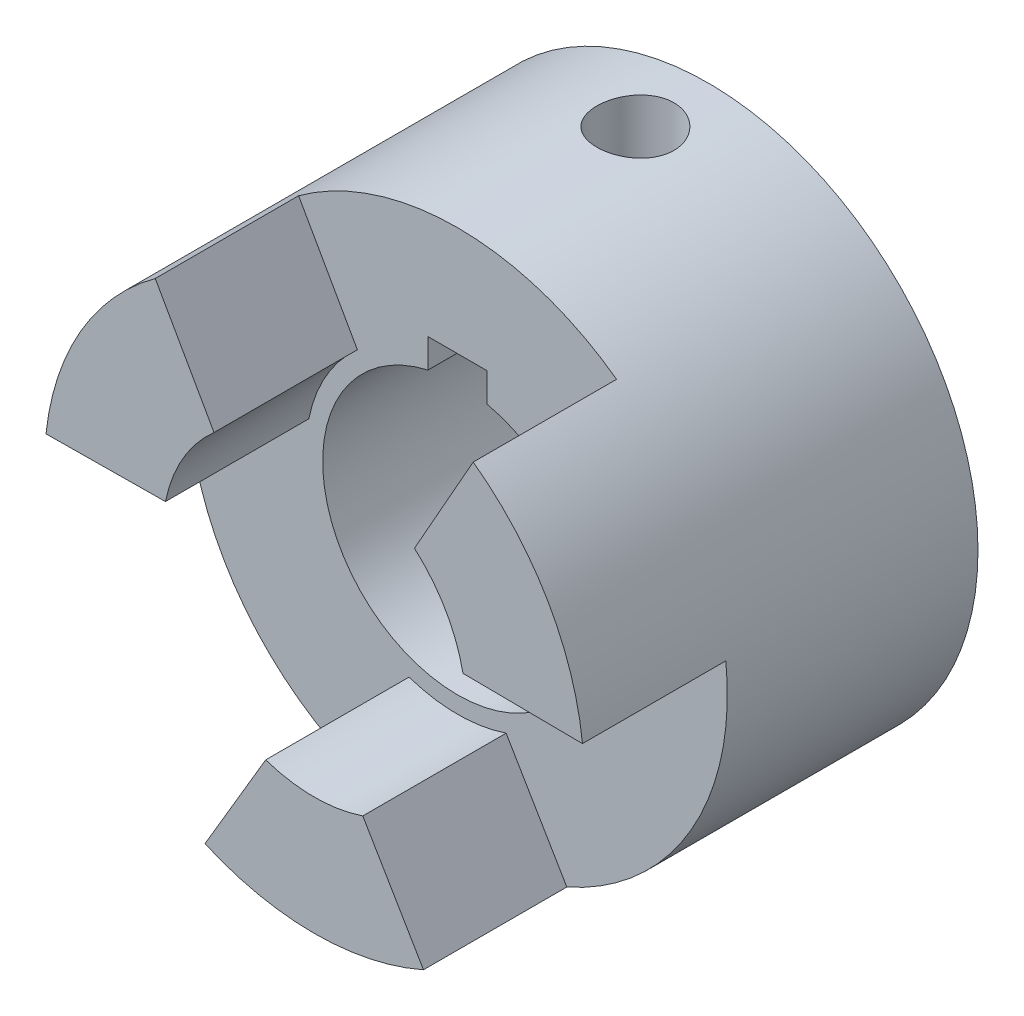
ISO-10303-21;
HEADER;
FILE_DESCRIPTION(('STEP AP214'),'2;1');
FILE_NAME('part.step','',(''),(''),'','','');
FILE_SCHEMA(('AUTOMOTIVE_DESIGN { 1 0 10303 214 1 1 1 1 }'));
ENDSEC;
DATA;
#1=APPLICATION_CONTEXT('core data for automotive mechanical design processes');
#2=APPLICATION_PROTOCOL_DEFINITION('international standard','automotive_design',2000,#1);
#3=PRODUCT_CONTEXT('',#1,'mechanical');
#4=PRODUCT('Part','Part','',(#3));
#5=PRODUCT_RELATED_PRODUCT_CATEGORY('part','',(#4));
#6=PRODUCT_DEFINITION_FORMATION('','',#4);
#7=PRODUCT_DEFINITION_CONTEXT('part definition',#1,'design');
#8=PRODUCT_DEFINITION('design','',#6,#7);
#9=PRODUCT_DEFINITION_SHAPE('','',#8);
#10=(LENGTH_UNIT() NAMED_UNIT(*) SI_UNIT(.MILLI.,.METRE.));
#11=(NAMED_UNIT(*) PLANE_ANGLE_UNIT() SI_UNIT($,.RADIAN.));
#12=(NAMED_UNIT(*) SI_UNIT($,.STERADIAN.) SOLID_ANGLE_UNIT());
#13=UNCERTAINTY_MEASURE_WITH_UNIT(LENGTH_MEASURE(1.E-05),#10,'distance_accuracy_value','');
#14=(GEOMETRIC_REPRESENTATION_CONTEXT(3) GLOBAL_UNCERTAINTY_ASSIGNED_CONTEXT((#13)) GLOBAL_UNIT_ASSIGNED_CONTEXT((#10,
#11,#12)) REPRESENTATION_CONTEXT('',''));
#15=CARTESIAN_POINT('',(0.,0.,0.));
#16=DIRECTION('',(0.,0.,1.));
#17=DIRECTION('',(1.,0.,0.));
#18=AXIS2_PLACEMENT_3D('',#15,#16,#17);
#19=CARTESIAN_POINT('',(0.,0.,20.65));
#20=DIRECTION('',(0.,0.,-1.));
#21=DIRECTION('',(-1.,0.,0.));
#22=AXIS2_PLACEMENT_3D('',#19,#20,#21);
#23=CYLINDRICAL_SURFACE('',#22,22.225);
#24=CARTESIAN_POINT('',(0.,22.225,9.175));
#25=CARTESIAN_POINT('',(-0.177372532942854,22.2249972543515,9.17499261308053));
#26=CARTESIAN_POINT('',(-0.354850399948266,22.2228543413594,9.1600863672689));
#27=CARTESIAN_POINT('',(-0.704852096668658,22.2145120385616,9.10086649245707));
#28=CARTESIAN_POINT('',(-0.877370818068795,22.2083086121327,9.05652359937904));
#29=CARTESIAN_POINT('',(-1.21233779879378,22.1925429326379,8.93977675399383));
#30=CARTESIAN_POINT('',(-1.37479331768552,22.1829831348434,8.86739331007585));
#31=CARTESIAN_POINT('',(-1.68522538951301,22.1615631533086,8.69666865130724));
#32=CARTESIAN_POINT('',(-1.83320409151772,22.1497033117895,8.59833129732758));
#33=CARTESIAN_POINT('',(-2.11156121501147,22.1249093670883,8.37774425654393));
#34=CARTESIAN_POINT('',(-2.24182175079207,22.1119689131174,8.25534650892612));
#35=CARTESIAN_POINT('',(-2.48002835136539,22.0865223693237,7.99043158383659));
#36=CARTESIAN_POINT('',(-2.58797317910011,22.0740163036128,7.84791329173105));
#37=CARTESIAN_POINT('',(-2.77893740764058,22.0507927185792,7.54601825652933));
#38=CARTESIAN_POINT('',(-2.86184379837958,22.0400834025882,7.38656934304464));
#39=CARTESIAN_POINT('',(-2.99965570904621,22.0217518243371,7.0558318371159));
#40=CARTESIAN_POINT('',(-3.05456261243032,22.0141294095569,6.8845438301172));
#41=CARTESIAN_POINT('',(-3.13445309119421,22.0028966652068,6.53622571879604));
#42=CARTESIAN_POINT('',(-3.15963772607625,21.9992593898744,6.35924261422916));
#43=CARTESIAN_POINT('',(-3.1799914177403,21.9963267795921,6.00352772524451));
#44=CARTESIAN_POINT('',(-3.17516204015659,21.9970312181636,5.82479603252471));
#45=CARTESIAN_POINT('',(-3.13578932460963,22.0026777932302,5.4720719685675));
#46=CARTESIAN_POINT('',(-3.10146916470387,22.0075880999923,5.29805410250442));
#47=CARTESIAN_POINT('',(-3.00443812120536,22.0210434511419,4.95827270104747));
#48=CARTESIAN_POINT('',(-2.94172650310753,22.0295885895644,4.79250937932705));
#49=CARTESIAN_POINT('',(-2.78945822996728,22.0493862330951,4.47325910788074));
#50=CARTESIAN_POINT('',(-2.69980630064438,22.0606483183299,4.31981821817508));
#51=CARTESIAN_POINT('',(-2.4962702351622,22.0846038460095,4.03007375129897));
#52=CARTESIAN_POINT('',(-2.38238465455236,22.0972973737546,3.89377119643243));
#53=CARTESIAN_POINT('',(-2.13238543141818,22.1228264578543,3.64087847011104));
#54=CARTESIAN_POINT('',(-1.99607975680891,22.1356622590839,3.52447807443463));
#55=CARTESIAN_POINT('',(-1.70576608109782,22.1599225931851,3.31617725861614));
#56=CARTESIAN_POINT('',(-1.55175801494515,22.1713471208704,3.2242769285084));
#57=CARTESIAN_POINT('',(-1.23025230140895,22.1915080462027,3.06757813593975));
#58=CARTESIAN_POINT('',(-1.06274783555435,22.2002430742161,3.00279347617785));
#59=CARTESIAN_POINT('',(-0.719084634272284,22.2140291032861,2.9023256349098));
#60=CARTESIAN_POINT('',(-0.542926429752159,22.2190803300435,2.86664067049386));
#61=CARTESIAN_POINT('',(-0.188595035544038,22.2248999013422,2.82563559242257));
#62=CARTESIAN_POINT('',(-0.0104526390235453,22.2257050662886,2.82005441923126));
#63=CARTESIAN_POINT('',(0.344225324872357,22.2230417753747,2.83872363273189));
#64=CARTESIAN_POINT('',(0.520760937101993,22.2195734391824,2.86297318409457));
#65=CARTESIAN_POINT('',(0.866429588550374,22.2087756505003,2.94039845728161));
#66=CARTESIAN_POINT('',(1.03559150406069,22.2014630698402,2.99344781394755));
#67=CARTESIAN_POINT('',(1.36261942363918,22.1837944415749,3.12683413613148));
#68=CARTESIAN_POINT('',(1.52048494016622,22.1734382627095,3.20717227854688));
#69=CARTESIAN_POINT('',(1.8215922670791,22.1507427375886,3.39347393446759));
#70=CARTESIAN_POINT('',(1.96473002515803,22.1383906807312,3.49960404465741));
#71=CARTESIAN_POINT('',(2.23125553050272,22.1131200870886,3.73424392073296));
#72=CARTESIAN_POINT('',(2.35464224123725,22.1002015206183,3.86275486042191));
#73=CARTESIAN_POINT('',(2.57910591335467,22.0751380976941,4.13966701278108));
#74=CARTESIAN_POINT('',(2.6800084525968,22.0629997770826,4.28821029160208));
#75=CARTESIAN_POINT('',(2.85542940396839,22.0409844847579,4.60029043373384));
#76=CARTESIAN_POINT('',(2.92994847564319,22.0311074565181,4.76382692210919));
#77=CARTESIAN_POINT('',(3.05021314579172,22.0147796029055,5.10071824590374));
#78=CARTESIAN_POINT('',(3.09605251584503,22.0083176225203,5.27403904216058));
#79=CARTESIAN_POINT('',(3.15795617455243,21.9995211720729,5.62601764067578));
#80=CARTESIAN_POINT('',(3.17402231261418,21.9971864456406,5.80467511073833));
#81=CARTESIAN_POINT('',(3.1758824971906,21.9969178067031,6.16051819960255));
#82=CARTESIAN_POINT('',(3.16195070821392,21.9989440373804,6.33770241650281));
#83=CARTESIAN_POINT('',(3.10479592163145,22.0070826718652,6.68718132194281));
#84=CARTESIAN_POINT('',(3.06157295420644,22.0131950714623,6.85947601552039));
#85=CARTESIAN_POINT('',(2.94715637335701,22.0288038829555,7.194221108364));
#86=CARTESIAN_POINT('',(2.8759801345313,22.0382981924558,7.35667755042383));
#87=CARTESIAN_POINT('',(2.70770451922401,22.0596038634222,7.66738688136354));
#88=CARTESIAN_POINT('',(2.61060443067045,22.0714152885321,7.81563937993984));
#89=CARTESIAN_POINT('',(2.39223466597663,22.0961531446146,8.09512823691465));
#90=CARTESIAN_POINT('',(2.27076147542829,22.1090884059355,8.22620482050856));
#91=CARTESIAN_POINT('',(2.00752315239733,22.1345414251083,8.46621253554867));
#92=CARTESIAN_POINT('',(1.86575329213172,22.1470590848466,8.57513849301423));
#93=CARTESIAN_POINT('',(1.56512168644748,22.1703370170694,8.76823102060738));
#94=CARTESIAN_POINT('',(1.4061784764587,22.1810882437725,8.85227181347566));
#95=CARTESIAN_POINT('',(1.07635879528743,22.1995326276888,8.99234184360968));
#96=CARTESIAN_POINT('',(0.905495085753381,22.2072289979989,9.04840052852391));
#97=CARTESIAN_POINT('',(0.611523040346121,22.2169095127051,9.11798269422379));
#98=CARTESIAN_POINT('',(0.490242064945984,22.2199281098463,9.13933210863946));
#99=CARTESIAN_POINT('',(0.245990937667989,22.2239742949424,9.16784324692752));
#100=CARTESIAN_POINT('',(0.12302080396911,22.2250019043077,9.17500512336807));
#101=CARTESIAN_POINT('',(0.,22.225,9.175));
#102=B_SPLINE_CURVE_WITH_KNOTS('',3,(#24,#25,#26,#27,#28,#29,#30,#31,#32,#33,#34,#35,#36,#37,
#38,#39,#40,#41,#42,#43,#44,#45,#46,#47,#48,#49,#50,#51,#52,#53,#54,#55,#56,#57,#58,#59,#60,#61,
#62,#63,#64,#65,#66,#67,#68,#69,#70,#71,#72,#73,#74,#75,#76,#77,#78,#79,#80,#81,#82,#83,#84,#85,
#86,#87,#88,#89,#90,#91,#92,#93,#94,#95,#96,#97,#98,#99,#100,#101),.UNSPECIFIED.,.T.,.F.,(4,2,2,
2,2,2,2,2,2,2,2,2,2,2,2,2,2,2,2,2,2,2,2,2,2,2,2,2,2,2,2,2,2,2,2,2,2,2,4),(0.,0.531668122197693,
1.06386558878678,1.59567454771251,2.12740443995392,2.66251510386462,3.19765542336743,
3.73517617335121,4.2726703618259,4.80650738344102,5.34031655851175,5.87012123820308,
6.39993962506167,6.93165421549765,7.463400507747,7.99996426271881,8.53652998946081,
9.07336851324163,9.61017414298082,10.1423170293666,10.6744450148605,11.2042568290739,
11.7340914956542,12.2674439687877,12.8008244229882,13.3382087300045,13.8755796023068,
14.411184168761,14.9467554642422,15.4774527230731,16.0081494350893,16.5385168086807,
17.068898751814,17.6039089042129,18.1390438820047,18.6768391543641,19.2140672653074,
19.5828218978377,19.9515725648791),.UNSPECIFIED.);
#103=CARTESIAN_POINT('',(0.,22.225,9.175));
#104=VERTEX_POINT('',#103);
#105=EDGE_CURVE('E11',#104,#104,#102,.T.);
#106=ORIENTED_EDGE('',*,*,#105,.T.);
#107=EDGE_LOOP('',(#106));
#108=FACE_BOUND('',#107,.T.);
#109=CARTESIAN_POINT('',(0.,0.,20.65));
#110=DIRECTION('',(0.,0.,1.));
#111=DIRECTION('',(1.,0.,0.));
#112=AXIS2_PLACEMENT_3D('',#109,#110,#111);
#113=CIRCLE('',#112,22.225);
#114=CARTESIAN_POINT('',(9.,-20.3211866041331,20.65));
#115=VERTEX_POINT('',#114);
#116=CARTESIAN_POINT('',(22.0986638342233,2.36636466800673,20.65));
#117=VERTEX_POINT('',#116);
#118=EDGE_CURVE('E51',#115,#117,#113,.T.);
#119=ORIENTED_EDGE('',*,*,#118,.F.);
#120=DIRECTION('',(0.,0.,-1.));
#121=VECTOR('',#120,1.);
#122=CARTESIAN_POINT('',(9.,-20.3211866041331,32.46));
#123=LINE('',#122,#121);
#124=CARTESIAN_POINT('',(9.,-20.3211866041331,32.46));
#125=VERTEX_POINT('',#124);
#126=EDGE_CURVE('E248',#125,#115,#123,.T.);
#127=ORIENTED_EDGE('',*,*,#126,.F.);
#128=CARTESIAN_POINT('',(0.,0.,32.46));
#129=DIRECTION('',(0.,0.,1.));
#130=DIRECTION('',(1.,0.,0.));
#131=AXIS2_PLACEMENT_3D('',#128,#129,#130);
#132=CIRCLE('',#131,22.225);
#133=CARTESIAN_POINT('',(-9.,-20.3211866041331,32.46));
#134=VERTEX_POINT('',#133);
#135=EDGE_CURVE('E224',#134,#125,#132,.T.);
#136=ORIENTED_EDGE('',*,*,#135,.F.);
#137=DIRECTION('',(0.,0.,-1.));
#138=VECTOR('',#137,1.);
#139=CARTESIAN_POINT('',(-9.,-20.3211866041331,32.46));
#140=LINE('',#139,#138);
#141=CARTESIAN_POINT('',(-9.,-20.3211866041331,20.65));
#142=VERTEX_POINT('',#141);
#143=EDGE_CURVE('E235',#134,#142,#140,.T.);
#144=ORIENTED_EDGE('',*,*,#143,.T.);
#145=CARTESIAN_POINT('',(-22.0986638342233,2.36636466800642,20.65));
#146=VERTEX_POINT('',#145);
#147=EDGE_CURVE('E175',#146,#142,#113,.T.);
#148=ORIENTED_EDGE('',*,*,#147,.F.);
#149=DIRECTION('',(0.,0.,-1.));
#150=VECTOR('',#149,1.);
#151=CARTESIAN_POINT('',(-22.0986638342233,2.36636466800642,32.46));
#152=LINE('',#151,#150);
#153=CARTESIAN_POINT('',(-22.0986638342233,2.36636466800642,32.46));
#154=VERTEX_POINT('',#153);
#155=EDGE_CURVE('E171',#154,#146,#152,.T.);
#156=ORIENTED_EDGE('',*,*,#155,.F.);
#157=CARTESIAN_POINT('',(0.,0.,32.46));
#158=DIRECTION('',(0.,0.,1.));
#159=DIRECTION('',(-0.499999999999992,-0.866025403784443,0.));
#160=AXIS2_PLACEMENT_3D('',#157,#158,#159);
#161=CIRCLE('',#160,22.225);
#162=CARTESIAN_POINT('',(-13.0986638342235,17.9548219361264,32.46));
#163=VERTEX_POINT('',#162);
#164=EDGE_CURVE('E156',#163,#154,#161,.T.);
#165=ORIENTED_EDGE('',*,*,#164,.F.);
#166=DIRECTION('',(0.,0.,-1.));
#167=VECTOR('',#166,1.);
#168=CARTESIAN_POINT('',(-13.0986638342235,17.9548219361264,32.46));
#169=LINE('',#168,#167);
#170=CARTESIAN_POINT('',(-13.0986638342235,17.9548219361264,20.65));
#171=VERTEX_POINT('',#170);
#172=EDGE_CURVE('E189',#163,#171,#169,.T.);
#173=ORIENTED_EDGE('',*,*,#172,.T.);
#174=CARTESIAN_POINT('',(13.0986638342232,17.9548219361266,20.65));
#175=VERTEX_POINT('',#174);
#176=EDGE_CURVE('E283',#175,#171,#113,.T.);
#177=ORIENTED_EDGE('',*,*,#176,.F.);
#178=DIRECTION('',(0.,0.,-1.));
#179=VECTOR('',#178,1.);
#180=CARTESIAN_POINT('',(13.0986638342232,17.9548219361266,32.46));
#181=LINE('',#180,#179);
#182=CARTESIAN_POINT('',(13.0986638342232,17.9548219361266,32.46));
#183=VERTEX_POINT('',#182);
#184=EDGE_CURVE('E221',#183,#175,#181,.T.);
#185=ORIENTED_EDGE('',*,*,#184,.F.);
#186=CARTESIAN_POINT('',(0.,0.,32.46));
#187=DIRECTION('',(0.,0.,1.));
#188=DIRECTION('',(-0.500000000000004,0.866025403784436,0.));
#189=AXIS2_PLACEMENT_3D('',#186,#187,#188);
#190=CIRCLE('',#189,22.225);
#191=CARTESIAN_POINT('',(22.0986638342233,2.36636466800673,32.46));
#192=VERTEX_POINT('',#191);
#193=EDGE_CURVE('E199',#192,#183,#190,.T.);
#194=ORIENTED_EDGE('',*,*,#193,.F.);
#195=DIRECTION('',(0.,0.,-1.));
#196=VECTOR('',#195,1.);
#197=CARTESIAN_POINT('',(22.0986638342233,2.36636466800673,32.46));
#198=LINE('',#197,#196);
#199=EDGE_CURVE('E210',#192,#117,#198,.T.);
#200=ORIENTED_EDGE('',*,*,#199,.T.);
#201=EDGE_LOOP('',(#119,#127,#136,#144,#148,#156,#165,#173,#177,#185,#194,#200));
#202=FACE_BOUND('',#201,.T.);
#203=CARTESIAN_POINT('',(0.,0.,0.));
#204=DIRECTION('',(0.,0.,1.));
#205=DIRECTION('',(1.,0.,0.));
#206=AXIS2_PLACEMENT_3D('',#203,#204,#205);
#207=CIRCLE('',#206,22.225);
#208=CARTESIAN_POINT('',(22.225,0.,0.));
#209=VERTEX_POINT('',#208);
#210=EDGE_CURVE('E281',#209,#209,#207,.T.);
#211=ORIENTED_EDGE('',*,*,#210,.T.);
#212=EDGE_LOOP('',(#211));
#213=FACE_BOUND('',#212,.T.);
#214=ADVANCED_FACE('F39',(#108,#202,#213),#23,.T.);
#215=CARTESIAN_POINT('',(0.,0.,20.65));
#216=DIRECTION('',(0.,0.,1.));
#217=DIRECTION('',(1.,0.,0.));
#218=AXIS2_PLACEMENT_3D('',#215,#216,#217);
#219=PLANE('',#218);
#220=DIRECTION('',(-0.999957362702515,-0.00923432601932678,0.));
#221=VECTOR('',#220,1.);
#222=CARTESIAN_POINT('',(-0.0237352655578459,2.57022044712233,20.65));
#223=LINE('',#222,#221);
#224=CARTESIAN_POINT('',(-12.256095748383,2.45725802602564,20.65));
#225=VERTEX_POINT('',#224);
#226=EDGE_CURVE('E190',#225,#146,#223,.T.);
#227=ORIENTED_EDGE('',*,*,#226,.T.);
#228=ORIENTED_EDGE('',*,*,#147,.T.);
#229=DIRECTION('',(-0.507975842270814,-0.861371315792009,0.));
#230=VECTOR('',#229,1.);
#231=CARTESIAN_POINT('',(2.21400856775522,-1.30566556649981,20.65));
#232=LINE('',#231,#230);
#233=CARTESIAN_POINT('',(-4.,-11.842719282327,20.65));
#234=VERTEX_POINT('',#233);
#235=EDGE_CURVE('E227',#234,#142,#232,.T.);
#236=ORIENTED_EDGE('',*,*,#235,.F.);
#237=CARTESIAN_POINT('',(0.,0.,20.65));
#238=DIRECTION('',(0.,0.,1.));
#239=DIRECTION('',(1.,0.,0.));
#240=AXIS2_PLACEMENT_3D('',#237,#238,#239);
#241=CIRCLE('',#240,12.5);
#242=CARTESIAN_POINT('',(4.,-11.842719282327,20.65));
#243=VERTEX_POINT('',#242);
#244=EDGE_CURVE('E238',#234,#243,#241,.T.);
#245=ORIENTED_EDGE('',*,*,#244,.T.);
#246=DIRECTION('',(0.507975842270814,-0.861371315792009,0.));
#247=VECTOR('',#246,1.);
#248=CARTESIAN_POINT('',(-2.21400856775522,-1.30566556649981,20.65));
#249=LINE('',#248,#247);
#250=EDGE_CURVE('E223',#243,#115,#249,.T.);
#251=ORIENTED_EDGE('',*,*,#250,.T.);
#252=ORIENTED_EDGE('',*,*,#118,.T.);
#253=DIRECTION('',(0.999957362702515,-0.00923432601931284,0.));
#254=VECTOR('',#253,1.);
#255=CARTESIAN_POINT('',(0.0237352655578101,2.57022044712233,20.65));
#256=LINE('',#255,#254);
#257=CARTESIAN_POINT('',(12.256095748383,2.45725802602581,20.65));
#258=VERTEX_POINT('',#257);
#259=EDGE_CURVE('E202',#258,#117,#256,.T.);
#260=ORIENTED_EDGE('',*,*,#259,.F.);
#261=CARTESIAN_POINT('',(0.,0.,20.65));
#262=DIRECTION('',(0.,0.,1.));
#263=DIRECTION('',(-0.500000000000004,0.866025403784436,0.));
#264=AXIS2_PLACEMENT_3D('',#261,#262,#263);
#265=CIRCLE('',#264,12.5);
#266=CARTESIAN_POINT('',(8.25609574838296,9.3854612563013,20.65));
#267=VERTEX_POINT('',#266);
#268=EDGE_CURVE('E66',#258,#267,#265,.T.);
#269=ORIENTED_EDGE('',*,*,#268,.T.);
#270=DIRECTION('',(0.491981520431697,0.870605641811329,0.));
#271=VECTOR('',#270,1.);
#272=CARTESIAN_POINT('',(2.23774383331305,-1.26455488062251,20.65));
#273=LINE('',#272,#271);
#274=EDGE_CURVE('E179',#267,#175,#273,.T.);
#275=ORIENTED_EDGE('',*,*,#274,.T.);
#276=ORIENTED_EDGE('',*,*,#176,.T.);
#277=DIRECTION('',(-0.491981520431709,0.870605641811322,0.));
#278=VECTOR('',#277,1.);
#279=CARTESIAN_POINT('',(-2.23774383331303,-1.26455488062254,20.65));
#280=LINE('',#279,#278);
#281=CARTESIAN_POINT('',(-8.25609574838309,9.38546125630118,20.65));
#282=VERTEX_POINT('',#281);
#283=EDGE_CURVE('E168',#282,#171,#280,.T.);
#284=ORIENTED_EDGE('',*,*,#283,.F.);
#285=CARTESIAN_POINT('',(0.,0.,20.65));
#286=DIRECTION('',(0.,0.,1.));
#287=DIRECTION('',(-0.499999999999992,-0.866025403784443,0.));
#288=AXIS2_PLACEMENT_3D('',#285,#286,#287);
#289=CIRCLE('',#288,12.5);
#290=EDGE_CURVE('E58',#282,#225,#289,.T.);
#291=ORIENTED_EDGE('',*,*,#290,.T.);
#292=EDGE_LOOP('',(#227,#228,#236,#245,#251,#252,#260,#269,#275,#276,#284,#291));
#293=FACE_BOUND('',#292,.T.);
#294=DIRECTION('',(0.,-1.,0.));
#295=VECTOR('',#294,1.);
#296=CARTESIAN_POINT('',(-2.44,13.2338749992795,20.65));
#297=LINE('',#296,#295);
#298=CARTESIAN_POINT('',(-2.44,13.2338749992795,20.65));
#299=VERTEX_POINT('',#298);
#300=CARTESIAN_POINT('',(-2.44,10.8438749992795,20.65));
#301=VERTEX_POINT('',#300);
#302=EDGE_CURVE('E258',#299,#301,#297,.T.);
#303=ORIENTED_EDGE('',*,*,#302,.F.);
#304=DIRECTION('',(-1.,0.,0.));
#305=VECTOR('',#304,1.);
#306=CARTESIAN_POINT('',(-2.44,13.2338749992795,20.65));
#307=LINE('',#306,#305);
#308=CARTESIAN_POINT('',(2.44,13.2338749992795,20.65));
#309=VERTEX_POINT('',#308);
#310=EDGE_CURVE('E266',#309,#299,#307,.T.);
#311=ORIENTED_EDGE('',*,*,#310,.F.);
#312=DIRECTION('',(0.,1.,0.));
#313=VECTOR('',#312,1.);
#314=CARTESIAN_POINT('',(2.44,13.2338749992795,20.65));
#315=LINE('',#314,#313);
#316=CARTESIAN_POINT('',(2.44,10.8438749992795,20.65));
#317=VERTEX_POINT('',#316);
#318=EDGE_CURVE('E263',#317,#309,#315,.T.);
#319=ORIENTED_EDGE('',*,*,#318,.F.);
#320=CARTESIAN_POINT('',(0.,0.,20.65));
#321=DIRECTION('',(0.,0.,1.));
#322=DIRECTION('',(1.,0.,0.));
#323=AXIS2_PLACEMENT_3D('',#320,#321,#322);
#324=CIRCLE('',#323,11.115);
#325=EDGE_CURVE('E260',#301,#317,#324,.T.);
#326=ORIENTED_EDGE('',*,*,#325,.F.);
#327=EDGE_LOOP('',(#303,#311,#319,#326));
#328=FACE_BOUND('',#327,.T.);
#329=ADVANCED_FACE('F291',(#293,#328),#219,.T.);
#330=CARTESIAN_POINT('',(0.,0.,0.));
#331=DIRECTION('',(0.,0.,1.));
#332=DIRECTION('',(1.,0.,0.));
#333=AXIS2_PLACEMENT_3D('',#330,#331,#332);
#334=PLANE('',#333);
#335=DIRECTION('',(1.,0.,0.));
#336=VECTOR('',#335,1.);
#337=CARTESIAN_POINT('',(-2.44,13.2338749992795,0.));
#338=LINE('',#337,#336);
#339=CARTESIAN_POINT('',(-2.44,13.2338749992795,0.));
#340=VERTEX_POINT('',#339);
#341=CARTESIAN_POINT('',(2.44,13.2338749992795,0.));
#342=VERTEX_POINT('',#341);
#343=EDGE_CURVE('E252',#340,#342,#338,.T.);
#344=ORIENTED_EDGE('',*,*,#343,.F.);
#345=DIRECTION('',(0.,1.,0.));
#346=VECTOR('',#345,1.);
#347=CARTESIAN_POINT('',(-2.44,13.2338749992795,0.));
#348=LINE('',#347,#346);
#349=CARTESIAN_POINT('',(-2.44,10.8438749992795,0.));
#350=VERTEX_POINT('',#349);
#351=EDGE_CURVE('E255',#350,#340,#348,.T.);
#352=ORIENTED_EDGE('',*,*,#351,.F.);
#353=CARTESIAN_POINT('',(0.,0.,0.));
#354=DIRECTION('',(0.,0.,1.));
#355=DIRECTION('',(1.,0.,0.));
#356=AXIS2_PLACEMENT_3D('',#353,#354,#355);
#357=CIRCLE('',#356,11.115);
#358=CARTESIAN_POINT('',(2.44,10.8438749992795,0.));
#359=VERTEX_POINT('',#358);
#360=EDGE_CURVE('E272',#359,#350,#357,.F.);
#361=ORIENTED_EDGE('',*,*,#360,.F.);
#362=DIRECTION('',(0.,-1.,0.));
#363=VECTOR('',#362,1.);
#364=CARTESIAN_POINT('',(2.44,13.2338749992795,0.));
#365=LINE('',#364,#363);
#366=EDGE_CURVE('E250',#342,#359,#365,.T.);
#367=ORIENTED_EDGE('',*,*,#366,.F.);
#368=EDGE_LOOP('',(#344,#352,#361,#367));
#369=FACE_BOUND('',#368,.T.);
#370=ORIENTED_EDGE('',*,*,#210,.F.);
#371=EDGE_LOOP('',(#370));
#372=FACE_BOUND('',#371,.T.);
#373=ADVANCED_FACE('F315',(#369,#372),#334,.F.);
#374=CARTESIAN_POINT('',(-2.44,13.2338749992795,-0.001000000000001));
#375=DIRECTION('',(-1.,0.,0.));
#376=DIRECTION('',(0.,-1.,0.));
#377=AXIS2_PLACEMENT_3D('',#374,#375,#376);
#378=PLANE('',#377);
#379=ORIENTED_EDGE('',*,*,#351,.T.);
#380=DIRECTION('',(0.,0.,1.));
#381=VECTOR('',#380,1.);
#382=CARTESIAN_POINT('',(-2.44,13.2338749992795,-0.001000000000001));
#383=LINE('',#382,#381);
#384=EDGE_CURVE('E270',#340,#299,#383,.T.);
#385=ORIENTED_EDGE('',*,*,#384,.T.);
#386=ORIENTED_EDGE('',*,*,#302,.T.);
#387=DIRECTION('',(0.,0.,1.));
#388=VECTOR('',#387,1.);
#389=CARTESIAN_POINT('',(-2.44,10.8438749992795,-0.001000000000001));
#390=LINE('',#389,#388);
#391=EDGE_CURVE('E269',#350,#301,#390,.T.);
#392=ORIENTED_EDGE('',*,*,#391,.F.);
#393=EDGE_LOOP('',(#379,#385,#386,#392));
#394=FACE_BOUND('',#393,.T.);
#395=ADVANCED_FACE('F467',(#394),#378,.F.);
#396=CARTESIAN_POINT('',(-2.44,13.2338749992795,-0.001000000000001));
#397=DIRECTION('',(0.,1.,0.));
#398=DIRECTION('',(0.,0.,1.));
#399=AXIS2_PLACEMENT_3D('',#396,#397,#398);
#400=PLANE('',#399);
#401=ORIENTED_EDGE('',*,*,#343,.T.);
#402=DIRECTION('',(0.,0.,1.));
#403=VECTOR('',#402,1.);
#404=CARTESIAN_POINT('',(2.44,13.2338749992795,-0.001000000000001));
#405=LINE('',#404,#403);
#406=EDGE_CURVE('E273',#342,#309,#405,.T.);
#407=ORIENTED_EDGE('',*,*,#406,.T.);
#408=ORIENTED_EDGE('',*,*,#310,.T.);
#409=ORIENTED_EDGE('',*,*,#384,.F.);
#410=EDGE_LOOP('',(#401,#407,#408,#409));
#411=FACE_BOUND('',#410,.T.);
#412=ADVANCED_FACE('F457',(#411),#400,.F.);
#413=CARTESIAN_POINT('',(2.44,13.2338749992795,-0.001000000000001));
#414=DIRECTION('',(1.,0.,0.));
#415=DIRECTION('',(0.,1.,0.));
#416=AXIS2_PLACEMENT_3D('',#413,#414,#415);
#417=PLANE('',#416);
#418=ORIENTED_EDGE('',*,*,#366,.T.);
#419=DIRECTION('',(0.,0.,1.));
#420=VECTOR('',#419,1.);
#421=CARTESIAN_POINT('',(2.44,10.8438749992795,-0.001000000000001));
#422=LINE('',#421,#420);
#423=EDGE_CURVE('E275',#359,#317,#422,.T.);
#424=ORIENTED_EDGE('',*,*,#423,.T.);
#425=ORIENTED_EDGE('',*,*,#318,.T.);
#426=ORIENTED_EDGE('',*,*,#406,.F.);
#427=EDGE_LOOP('',(#418,#424,#425,#426));
#428=FACE_BOUND('',#427,.T.);
#429=ADVANCED_FACE('F446',(#428),#417,.F.);
#430=CARTESIAN_POINT('',(0.,0.,-0.001000000000001));
#431=DIRECTION('',(0.,0.,1.));
#432=DIRECTION('',(1.,0.,0.));
#433=AXIS2_PLACEMENT_3D('',#430,#431,#432);
#434=CYLINDRICAL_SURFACE('',#433,11.115);
#435=ORIENTED_EDGE('',*,*,#360,.T.);
#436=ORIENTED_EDGE('',*,*,#391,.T.);
#437=ORIENTED_EDGE('',*,*,#325,.T.);
#438=ORIENTED_EDGE('',*,*,#423,.F.);
#439=EDGE_LOOP('',(#435,#436,#437,#438));
#440=FACE_BOUND('',#439,.T.);
#441=ADVANCED_FACE('F436',(#440),#434,.F.);
#442=CARTESIAN_POINT('',(-2.21400856775522,-1.30566556649981,32.46));
#443=DIRECTION('',(0.861371315792009,0.507975842270814,0.));
#444=DIRECTION('',(-0.507975842270814,0.861371315792009,0.));
#445=AXIS2_PLACEMENT_3D('',#442,#443,#444);
#446=PLANE('',#445);
#447=ORIENTED_EDGE('',*,*,#250,.F.);
#448=DIRECTION('',(0.,0.,-1.));
#449=VECTOR('',#448,1.);
#450=CARTESIAN_POINT('',(4.,-11.842719282327,32.46));
#451=LINE('',#450,#449);
#452=CARTESIAN_POINT('',(4.,-11.842719282327,32.46));
#453=VERTEX_POINT('',#452);
#454=EDGE_CURVE('E246',#453,#243,#451,.T.);
#455=ORIENTED_EDGE('',*,*,#454,.F.);
#456=DIRECTION('',(0.507975842270814,-0.861371315792009,0.));
#457=VECTOR('',#456,1.);
#458=CARTESIAN_POINT('',(-2.21400856775522,-1.30566556649981,32.46));
#459=LINE('',#458,#457);
#460=EDGE_CURVE('E226',#453,#125,#459,.T.);
#461=ORIENTED_EDGE('',*,*,#460,.T.);
#462=ORIENTED_EDGE('',*,*,#126,.T.);
#463=EDGE_LOOP('',(#447,#455,#461,#462));
#464=FACE_BOUND('',#463,.T.);
#465=ADVANCED_FACE('F427',(#464),#446,.T.);
#466=CARTESIAN_POINT('',(0.,0.,32.46));
#467=DIRECTION('',(0.,0.,-1.));
#468=DIRECTION('',(-1.,0.,0.));
#469=AXIS2_PLACEMENT_3D('',#466,#467,#468);
#470=CYLINDRICAL_SURFACE('',#469,12.5);
#471=ORIENTED_EDGE('',*,*,#244,.F.);
#472=DIRECTION('',(0.,0.,-1.));
#473=VECTOR('',#472,1.);
#474=CARTESIAN_POINT('',(-4.,-11.842719282327,32.46));
#475=LINE('',#474,#473);
#476=CARTESIAN_POINT('',(-4.,-11.842719282327,32.46));
#477=VERTEX_POINT('',#476);
#478=EDGE_CURVE('E244',#477,#234,#475,.T.);
#479=ORIENTED_EDGE('',*,*,#478,.F.);
#480=CARTESIAN_POINT('',(0.,0.,32.46));
#481=DIRECTION('',(0.,0.,1.));
#482=DIRECTION('',(1.,0.,0.));
#483=AXIS2_PLACEMENT_3D('',#480,#481,#482);
#484=CIRCLE('',#483,12.5);
#485=EDGE_CURVE('E230',#477,#453,#484,.T.);
#486=ORIENTED_EDGE('',*,*,#485,.T.);
#487=ORIENTED_EDGE('',*,*,#454,.T.);
#488=EDGE_LOOP('',(#471,#479,#486,#487));
#489=FACE_BOUND('',#488,.T.);
#490=ADVANCED_FACE('F417',(#489),#470,.F.);
#491=CARTESIAN_POINT('',(2.21400856775522,-1.30566556649981,32.46));
#492=DIRECTION('',(0.861371315792009,-0.507975842270814,0.));
#493=DIRECTION('',(0.507975842270814,0.861371315792009,0.));
#494=AXIS2_PLACEMENT_3D('',#491,#492,#493);
#495=PLANE('',#494);
#496=ORIENTED_EDGE('',*,*,#235,.T.);
#497=ORIENTED_EDGE('',*,*,#143,.F.);
#498=DIRECTION('',(-0.507975842270814,-0.861371315792009,0.));
#499=VECTOR('',#498,1.);
#500=CARTESIAN_POINT('',(2.21400856775522,-1.30566556649981,32.46));
#501=LINE('',#500,#499);
#502=EDGE_CURVE('E233',#477,#134,#501,.T.);
#503=ORIENTED_EDGE('',*,*,#502,.F.);
#504=ORIENTED_EDGE('',*,*,#478,.T.);
#505=EDGE_LOOP('',(#496,#497,#503,#504));
#506=FACE_BOUND('',#505,.T.);
#507=ADVANCED_FACE('F405',(#506),#495,.F.);
#508=CARTESIAN_POINT('',(0.,0.,32.46));
#509=DIRECTION('',(0.,0.,1.));
#510=DIRECTION('',(1.,0.,0.));
#511=AXIS2_PLACEMENT_3D('',#508,#509,#510);
#512=PLANE('',#511);
#513=ORIENTED_EDGE('',*,*,#135,.T.);
#514=ORIENTED_EDGE('',*,*,#460,.F.);
#515=ORIENTED_EDGE('',*,*,#485,.F.);
#516=ORIENTED_EDGE('',*,*,#502,.T.);
#517=EDGE_LOOP('',(#513,#514,#515,#516));
#518=FACE_BOUND('',#517,.T.);
#519=ADVANCED_FACE('F388',(#518),#512,.T.);
#520=CARTESIAN_POINT('',(2.23774383331305,-1.26455488062251,32.46));
#521=DIRECTION('',(-0.870605641811329,0.491981520431697,0.));
#522=DIRECTION('',(-0.491981520431697,-0.870605641811329,0.));
#523=AXIS2_PLACEMENT_3D('',#520,#521,#522);
#524=PLANE('',#523);
#525=ORIENTED_EDGE('',*,*,#274,.F.);
#526=DIRECTION('',(0.,0.,-1.));
#527=VECTOR('',#526,1.);
#528=CARTESIAN_POINT('',(8.25609574838296,9.3854612563013,32.46));
#529=LINE('',#528,#527);
#530=CARTESIAN_POINT('',(8.25609574838296,9.3854612563013,32.46));
#531=VERTEX_POINT('',#530);
#532=EDGE_CURVE('E219',#531,#267,#529,.T.);
#533=ORIENTED_EDGE('',*,*,#532,.F.);
#534=DIRECTION('',(0.491981520431697,0.870605641811329,0.));
#535=VECTOR('',#534,1.);
#536=CARTESIAN_POINT('',(2.23774383331305,-1.26455488062251,32.46));
#537=LINE('',#536,#535);
#538=EDGE_CURVE('E201',#531,#183,#537,.T.);
#539=ORIENTED_EDGE('',*,*,#538,.T.);
#540=ORIENTED_EDGE('',*,*,#184,.T.);
#541=EDGE_LOOP('',(#525,#533,#539,#540));
#542=FACE_BOUND('',#541,.T.);
#543=ADVANCED_FACE('F380',(#542),#524,.T.);
#544=CARTESIAN_POINT('',(0.,0.,32.46));
#545=DIRECTION('',(0.,0.,-1.));
#546=DIRECTION('',(-1.,0.,0.));
#547=AXIS2_PLACEMENT_3D('',#544,#545,#546);
#548=CYLINDRICAL_SURFACE('',#547,12.5);
#549=ORIENTED_EDGE('',*,*,#268,.F.);
#550=DIRECTION('',(0.,0.,-1.));
#551=VECTOR('',#550,1.);
#552=CARTESIAN_POINT('',(12.256095748383,2.45725802602581,32.46));
#553=LINE('',#552,#551);
#554=CARTESIAN_POINT('',(12.256095748383,2.45725802602581,32.46));
#555=VERTEX_POINT('',#554);
#556=EDGE_CURVE('E217',#555,#258,#553,.T.);
#557=ORIENTED_EDGE('',*,*,#556,.F.);
#558=CARTESIAN_POINT('',(0.,0.,32.46));
#559=DIRECTION('',(0.,0.,1.));
#560=DIRECTION('',(-0.500000000000004,0.866025403784436,0.));
#561=AXIS2_PLACEMENT_3D('',#558,#559,#560);
#562=CIRCLE('',#561,12.5);
#563=EDGE_CURVE('E205',#555,#531,#562,.T.);
#564=ORIENTED_EDGE('',*,*,#563,.T.);
#565=ORIENTED_EDGE('',*,*,#532,.T.);
#566=EDGE_LOOP('',(#549,#557,#564,#565));
#567=FACE_BOUND('',#566,.T.);
#568=ADVANCED_FACE('F370',(#567),#548,.F.);
#569=CARTESIAN_POINT('',(0.0237352655578101,2.57022044712233,32.46));
#570=DIRECTION('',(0.00923432601931284,0.999957362702515,0.));
#571=DIRECTION('',(-0.999957362702515,0.00923432601931284,0.));
#572=AXIS2_PLACEMENT_3D('',#569,#570,#571);
#573=PLANE('',#572);
#574=ORIENTED_EDGE('',*,*,#259,.T.);
#575=ORIENTED_EDGE('',*,*,#199,.F.);
#576=DIRECTION('',(0.999957362702515,-0.00923432601931284,0.));
#577=VECTOR('',#576,1.);
#578=CARTESIAN_POINT('',(0.0237352655578101,2.57022044712233,32.46));
#579=LINE('',#578,#577);
#580=EDGE_CURVE('E208',#555,#192,#579,.T.);
#581=ORIENTED_EDGE('',*,*,#580,.F.);
#582=ORIENTED_EDGE('',*,*,#556,.T.);
#583=EDGE_LOOP('',(#574,#575,#581,#582));
#584=FACE_BOUND('',#583,.T.);
#585=ADVANCED_FACE('F359',(#584),#573,.F.);
#586=CARTESIAN_POINT('',(0.,0.,32.46));
#587=DIRECTION('',(0.,0.,1.));
#588=DIRECTION('',(-0.500000000000004,0.866025403784436,0.));
#589=AXIS2_PLACEMENT_3D('',#586,#587,#588);
#590=PLANE('',#589);
#591=ORIENTED_EDGE('',*,*,#193,.T.);
#592=ORIENTED_EDGE('',*,*,#538,.F.);
#593=ORIENTED_EDGE('',*,*,#563,.F.);
#594=ORIENTED_EDGE('',*,*,#580,.T.);
#595=EDGE_LOOP('',(#591,#592,#593,#594));
#596=FACE_BOUND('',#595,.T.);
#597=ADVANCED_FACE('F306',(#596),#590,.T.);
#598=CARTESIAN_POINT('',(-0.0237352655578459,2.57022044712233,32.46));
#599=DIRECTION('',(0.00923432601932678,-0.999957362702515,0.));
#600=DIRECTION('',(0.999957362702515,0.00923432601932678,0.));
#601=AXIS2_PLACEMENT_3D('',#598,#599,#600);
#602=PLANE('',#601);
#603=ORIENTED_EDGE('',*,*,#226,.F.);
#604=DIRECTION('',(0.,0.,-1.));
#605=VECTOR('',#604,1.);
#606=CARTESIAN_POINT('',(-12.256095748383,2.45725802602564,32.46));
#607=LINE('',#606,#605);
#608=CARTESIAN_POINT('',(-12.256095748383,2.45725802602564,32.46));
#609=VERTEX_POINT('',#608);
#610=EDGE_CURVE('E180',#609,#225,#607,.T.);
#611=ORIENTED_EDGE('',*,*,#610,.F.);
#612=DIRECTION('',(-0.999957362702515,-0.00923432601932678,0.));
#613=VECTOR('',#612,1.);
#614=CARTESIAN_POINT('',(-0.0237352655578459,2.57022044712233,32.46));
#615=LINE('',#614,#613);
#616=EDGE_CURVE('E161',#609,#154,#615,.T.);
#617=ORIENTED_EDGE('',*,*,#616,.T.);
#618=ORIENTED_EDGE('',*,*,#155,.T.);
#619=EDGE_LOOP('',(#603,#611,#617,#618));
#620=FACE_BOUND('',#619,.T.);
#621=ADVANCED_FACE('F182',(#620),#602,.T.);
#622=CARTESIAN_POINT('',(0.,0.,32.46));
#623=DIRECTION('',(0.,0.,-1.));
#624=DIRECTION('',(-1.,0.,0.));
#625=AXIS2_PLACEMENT_3D('',#622,#623,#624);
#626=CYLINDRICAL_SURFACE('',#625,12.5);
#627=ORIENTED_EDGE('',*,*,#290,.F.);
#628=DIRECTION('',(0.,0.,-1.));
#629=VECTOR('',#628,1.);
#630=CARTESIAN_POINT('',(-8.25609574838309,9.38546125630118,32.46));
#631=LINE('',#630,#629);
#632=CARTESIAN_POINT('',(-8.25609574838309,9.38546125630118,32.46));
#633=VERTEX_POINT('',#632);
#634=EDGE_CURVE('E196',#633,#282,#631,.T.);
#635=ORIENTED_EDGE('',*,*,#634,.F.);
#636=CARTESIAN_POINT('',(0.,0.,32.46));
#637=DIRECTION('',(0.,0.,1.));
#638=DIRECTION('',(-0.499999999999992,-0.866025403784443,0.));
#639=AXIS2_PLACEMENT_3D('',#636,#637,#638);
#640=CIRCLE('',#639,12.5);
#641=EDGE_CURVE('E183',#633,#609,#640,.T.);
#642=ORIENTED_EDGE('',*,*,#641,.T.);
#643=ORIENTED_EDGE('',*,*,#610,.T.);
#644=EDGE_LOOP('',(#627,#635,#642,#643));
#645=FACE_BOUND('',#644,.T.);
#646=ADVANCED_FACE('F298',(#645),#626,.F.);
#647=CARTESIAN_POINT('',(-2.23774383331303,-1.26455488062254,32.46));
#648=DIRECTION('',(-0.870605641811322,-0.491981520431709,0.));
#649=DIRECTION('',(0.491981520431709,-0.870605641811322,0.));
#650=AXIS2_PLACEMENT_3D('',#647,#648,#649);
#651=PLANE('',#650);
#652=ORIENTED_EDGE('',*,*,#283,.T.);
#653=ORIENTED_EDGE('',*,*,#172,.F.);
#654=DIRECTION('',(-0.491981520431709,0.870605641811322,0.));
#655=VECTOR('',#654,1.);
#656=CARTESIAN_POINT('',(-2.23774383331303,-1.26455488062254,32.46));
#657=LINE('',#656,#655);
#658=EDGE_CURVE('E164',#633,#163,#657,.T.);
#659=ORIENTED_EDGE('',*,*,#658,.F.);
#660=ORIENTED_EDGE('',*,*,#634,.T.);
#661=EDGE_LOOP('',(#652,#653,#659,#660));
#662=FACE_BOUND('',#661,.T.);
#663=ADVANCED_FACE('F297',(#662),#651,.F.);
#664=CARTESIAN_POINT('',(0.,0.,32.46));
#665=DIRECTION('',(0.,0.,1.));
#666=DIRECTION('',(-0.499999999999992,-0.866025403784443,0.));
#667=AXIS2_PLACEMENT_3D('',#664,#665,#666);
#668=PLANE('',#667);
#669=ORIENTED_EDGE('',*,*,#164,.T.);
#670=ORIENTED_EDGE('',*,*,#616,.F.);
#671=ORIENTED_EDGE('',*,*,#641,.F.);
#672=ORIENTED_EDGE('',*,*,#658,.T.);
#673=EDGE_LOOP('',(#669,#670,#671,#672));
#674=FACE_BOUND('',#673,.T.);
#675=ADVANCED_FACE('F158',(#674),#668,.T.);
#676=CARTESIAN_POINT('',(0.,15.685,6.));
#677=DIRECTION('',(0.,1.,0.));
#678=DIRECTION('',(0.,0.,1.));
#679=AXIS2_PLACEMENT_3D('',#676,#677,#678);
#680=CYLINDRICAL_SURFACE('',#679,3.175);
#681=CARTESIAN_POINT('',(0.,15.685,6.));
#682=DIRECTION('',(0.,1.,0.));
#683=DIRECTION('',(0.,0.,1.));
#684=AXIS2_PLACEMENT_3D('',#681,#682,#683);
#685=CIRCLE('',#684,3.175);
#686=CARTESIAN_POINT('',(0.,15.685,9.175));
#687=VERTEX_POINT('',#686);
#688=EDGE_CURVE('E192',#687,#687,#685,.T.);
#689=ORIENTED_EDGE('',*,*,#688,.F.);
#690=EDGE_LOOP('',(#689));
#691=FACE_BOUND('',#690,.T.);
#692=ORIENTED_EDGE('',*,*,#105,.F.);
#693=EDGE_LOOP('',(#692));
#694=FACE_BOUND('',#693,.T.);
#695=ADVANCED_FACE('F319',(#691,#694),#680,.F.);
#696=CARTESIAN_POINT('',(0.,15.685,6.));
#697=DIRECTION('',(0.,1.,0.));
#698=DIRECTION('',(0.,0.,1.));
#699=AXIS2_PLACEMENT_3D('',#696,#697,#698);
#700=PLANE('',#699);
#701=ORIENTED_EDGE('',*,*,#688,.T.);
#702=EDGE_LOOP('',(#701));
#703=FACE_BOUND('',#702,.T.);
#704=ADVANCED_FACE('F321',(#703),#700,.T.);
#705=CLOSED_SHELL('',(#214,#329,#373,#395,#412,#429,#441,#465,#490,#507,#519,#543,#568,#585,
#597,#621,#646,#663,#675,#695,#704));
#706=MANIFOLD_SOLID_BREP('B2',#705);
#707=ADVANCED_BREP_SHAPE_REPRESENTATION('',(#18,#706),#14);
#708=SHAPE_DEFINITION_REPRESENTATION(#9,#707);
ENDSEC;
END-ISO-10303-21;
